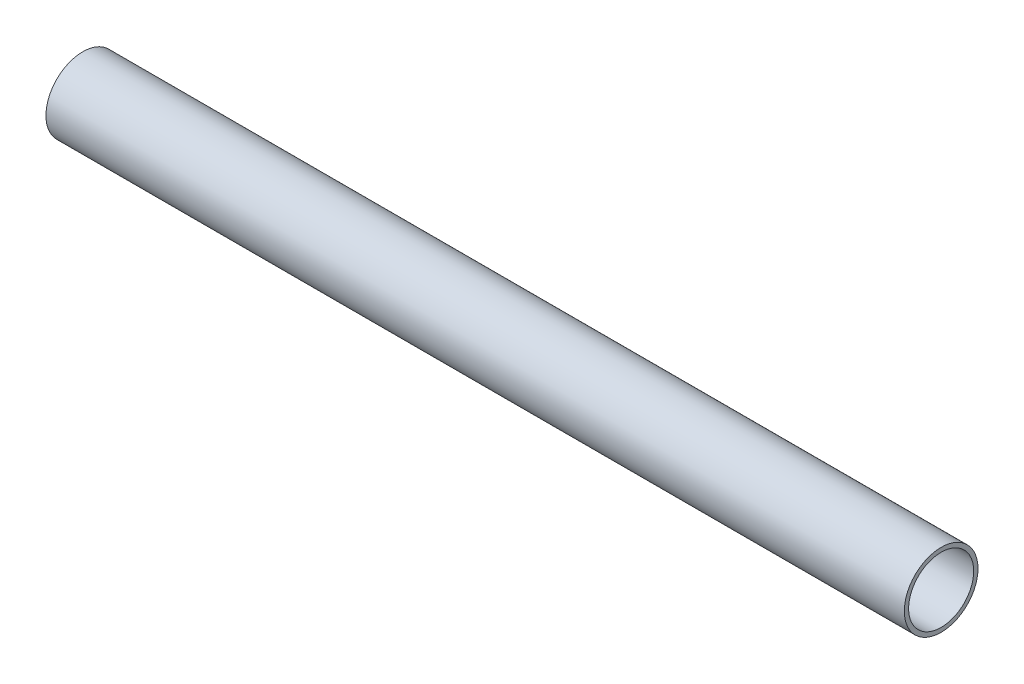
ISO-10303-21;
HEADER;
FILE_DESCRIPTION(('STEP AP214'),'2;1');
FILE_NAME('part.step','',(''),(''),'','','');
FILE_SCHEMA(('AUTOMOTIVE_DESIGN { 1 0 10303 214 1 1 1 1 }'));
ENDSEC;
DATA;
#1=APPLICATION_CONTEXT('core data for automotive mechanical design processes');
#2=APPLICATION_PROTOCOL_DEFINITION('international standard','automotive_design',2000,#1);
#3=PRODUCT_CONTEXT('',#1,'mechanical');
#4=PRODUCT('Part','Part','',(#3));
#5=PRODUCT_RELATED_PRODUCT_CATEGORY('part','',(#4));
#6=PRODUCT_DEFINITION_FORMATION('','',#4);
#7=PRODUCT_DEFINITION_CONTEXT('part definition',#1,'design');
#8=PRODUCT_DEFINITION('design','',#6,#7);
#9=PRODUCT_DEFINITION_SHAPE('','',#8);
#10=(LENGTH_UNIT() NAMED_UNIT(*) SI_UNIT(.MILLI.,.METRE.));
#11=(NAMED_UNIT(*) PLANE_ANGLE_UNIT() SI_UNIT($,.RADIAN.));
#12=(NAMED_UNIT(*) SI_UNIT($,.STERADIAN.) SOLID_ANGLE_UNIT());
#13=UNCERTAINTY_MEASURE_WITH_UNIT(LENGTH_MEASURE(1.E-05),#10,'distance_accuracy_value','');
#14=(GEOMETRIC_REPRESENTATION_CONTEXT(3) GLOBAL_UNCERTAINTY_ASSIGNED_CONTEXT((#13)) GLOBAL_UNIT_ASSIGNED_CONTEXT((#10,
#11,#12)) REPRESENTATION_CONTEXT('',''));
#15=CARTESIAN_POINT('',(0.,0.,0.));
#16=DIRECTION('',(0.,0.,1.));
#17=DIRECTION('',(1.,0.,0.));
#18=AXIS2_PLACEMENT_3D('',#15,#16,#17);
#19=CARTESIAN_POINT('',(2000.,0.,0.));
#20=DIRECTION('',(1.,0.,0.));
#21=DIRECTION('',(0.,0.,-1.));
#22=AXIS2_PLACEMENT_3D('',#19,#20,#21);
#23=PLANE('',#22);
#24=CARTESIAN_POINT('',(2000.,0.,0.));
#25=DIRECTION('',(1.,0.,0.));
#26=DIRECTION('',(0.,0.,-1.));
#27=AXIS2_PLACEMENT_3D('',#24,#25,#26);
#28=CIRCLE('',#27,85.85);
#29=CARTESIAN_POINT('',(2000.,0.,-85.85));
#30=VERTEX_POINT('',#29);
#31=EDGE_CURVE('E10',#30,#30,#28,.T.);
#32=ORIENTED_EDGE('',*,*,#31,.T.);
#33=EDGE_LOOP('',(#32));
#34=FACE_BOUND('',#33,.T.);
#35=CARTESIAN_POINT('',(2000.,0.,0.));
#36=DIRECTION('',(1.,0.,0.));
#37=DIRECTION('',(0.,0.,-1.));
#38=AXIS2_PLACEMENT_3D('',#35,#36,#37);
#39=CIRCLE('',#38,75.85);
#40=CARTESIAN_POINT('',(2000.,0.,-75.85));
#41=VERTEX_POINT('',#40);
#42=EDGE_CURVE('E46',#41,#41,#39,.T.);
#43=ORIENTED_EDGE('',*,*,#42,.F.);
#44=EDGE_LOOP('',(#43));
#45=FACE_BOUND('',#44,.T.);
#46=ADVANCED_FACE('F35',(#34,#45),#23,.T.);
#47=CARTESIAN_POINT('',(0.,0.,0.));
#48=DIRECTION('',(1.,0.,0.));
#49=DIRECTION('',(0.,0.,-1.));
#50=AXIS2_PLACEMENT_3D('',#47,#48,#49);
#51=PLANE('',#50);
#52=CARTESIAN_POINT('',(0.,0.,0.));
#53=DIRECTION('',(1.,0.,0.));
#54=DIRECTION('',(0.,0.,-1.));
#55=AXIS2_PLACEMENT_3D('',#52,#53,#54);
#56=CIRCLE('',#55,85.85);
#57=CARTESIAN_POINT('',(0.,0.,-85.85));
#58=VERTEX_POINT('',#57);
#59=EDGE_CURVE('E39',#58,#58,#56,.T.);
#60=ORIENTED_EDGE('',*,*,#59,.F.);
#61=EDGE_LOOP('',(#60));
#62=FACE_BOUND('',#61,.T.);
#63=CARTESIAN_POINT('',(0.,0.,0.));
#64=DIRECTION('',(1.,0.,0.));
#65=DIRECTION('',(0.,0.,-1.));
#66=AXIS2_PLACEMENT_3D('',#63,#64,#65);
#67=CIRCLE('',#66,75.85);
#68=CARTESIAN_POINT('',(0.,0.,-75.85));
#69=VERTEX_POINT('',#68);
#70=EDGE_CURVE('E48',#69,#69,#67,.T.);
#71=ORIENTED_EDGE('',*,*,#70,.T.);
#72=EDGE_LOOP('',(#71));
#73=FACE_BOUND('',#72,.T.);
#74=ADVANCED_FACE('F58',(#62,#73),#51,.F.);
#75=CARTESIAN_POINT('',(2000.,0.,0.));
#76=DIRECTION('',(-1.,0.,0.));
#77=DIRECTION('',(0.,0.,1.));
#78=AXIS2_PLACEMENT_3D('',#75,#76,#77);
#79=CYLINDRICAL_SURFACE('',#78,85.85);
#80=ORIENTED_EDGE('',*,*,#31,.F.);
#81=EDGE_LOOP('',(#80));
#82=FACE_BOUND('',#81,.T.);
#83=ORIENTED_EDGE('',*,*,#59,.T.);
#84=EDGE_LOOP('',(#83));
#85=FACE_BOUND('',#84,.T.);
#86=ADVANCED_FACE('F37',(#82,#85),#79,.T.);
#87=CARTESIAN_POINT('',(2000.,0.,0.));
#88=DIRECTION('',(-1.,0.,0.));
#89=DIRECTION('',(0.,0.,1.));
#90=AXIS2_PLACEMENT_3D('',#87,#88,#89);
#91=CYLINDRICAL_SURFACE('',#90,75.85);
#92=ORIENTED_EDGE('',*,*,#42,.T.);
#93=EDGE_LOOP('',(#92));
#94=FACE_BOUND('',#93,.T.);
#95=ORIENTED_EDGE('',*,*,#70,.F.);
#96=EDGE_LOOP('',(#95));
#97=FACE_BOUND('',#96,.T.);
#98=ADVANCED_FACE('F54',(#94,#97),#91,.F.);
#99=CLOSED_SHELL('',(#46,#74,#86,#98));
#100=MANIFOLD_SOLID_BREP('B2',#99);
#101=ADVANCED_BREP_SHAPE_REPRESENTATION('',(#18,#100),#14);
#102=SHAPE_DEFINITION_REPRESENTATION(#9,#101);
ENDSEC;
END-ISO-10303-21;
